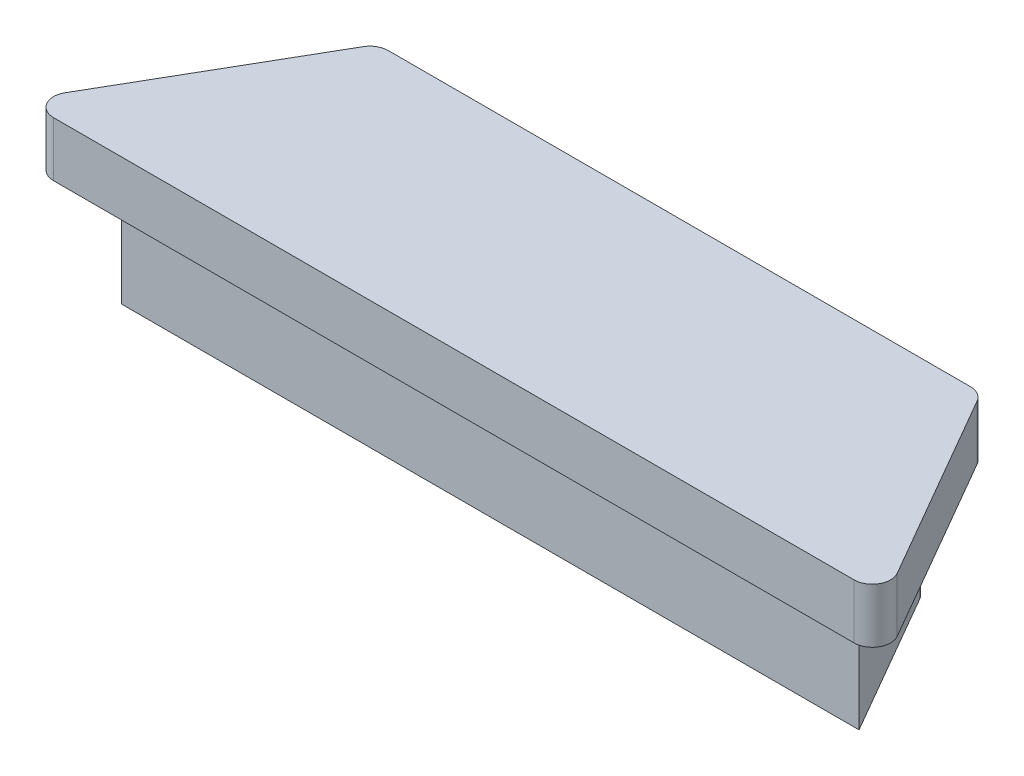
ISO-10303-21;
HEADER;
FILE_DESCRIPTION(('STEP AP214'),'2;1');
FILE_NAME('part.step','',(''),(''),'','','');
FILE_SCHEMA(('AUTOMOTIVE_DESIGN { 1 0 10303 214 1 1 1 1 }'));
ENDSEC;
DATA;
#1=APPLICATION_CONTEXT('core data for automotive mechanical design processes');
#2=APPLICATION_PROTOCOL_DEFINITION('international standard','automotive_design',2000,#1);
#3=PRODUCT_CONTEXT('',#1,'mechanical');
#4=PRODUCT('Part','Part','',(#3));
#5=PRODUCT_RELATED_PRODUCT_CATEGORY('part','',(#4));
#6=PRODUCT_DEFINITION_FORMATION('','',#4);
#7=PRODUCT_DEFINITION_CONTEXT('part definition',#1,'design');
#8=PRODUCT_DEFINITION('design','',#6,#7);
#9=PRODUCT_DEFINITION_SHAPE('','',#8);
#10=(LENGTH_UNIT() NAMED_UNIT(*) SI_UNIT(.MILLI.,.METRE.));
#11=(NAMED_UNIT(*) PLANE_ANGLE_UNIT() SI_UNIT($,.RADIAN.));
#12=(NAMED_UNIT(*) SI_UNIT($,.STERADIAN.) SOLID_ANGLE_UNIT());
#13=UNCERTAINTY_MEASURE_WITH_UNIT(LENGTH_MEASURE(1.E-05),#10,'distance_accuracy_value','');
#14=(GEOMETRIC_REPRESENTATION_CONTEXT(3) GLOBAL_UNCERTAINTY_ASSIGNED_CONTEXT((#13)) GLOBAL_UNIT_ASSIGNED_CONTEXT((#10,
#11,#12)) REPRESENTATION_CONTEXT('',''));
#15=CARTESIAN_POINT('',(0.,0.,0.));
#16=DIRECTION('',(0.,0.,1.));
#17=DIRECTION('',(1.,0.,0.));
#18=AXIS2_PLACEMENT_3D('',#15,#16,#17);
#19=CARTESIAN_POINT('',(-21.0429613812121,6.,-70.8226089891099));
#20=DIRECTION('',(0.,-1.,0.));
#21=DIRECTION('',(0.,0.,-1.));
#22=AXIS2_PLACEMENT_3D('',#19,#20,#21);
#23=CYLINDRICAL_SURFACE('',#22,0.999999999999986);
#24=CARTESIAN_POINT('',(-21.0429613812121,0.,-70.8226089891099));
#25=DIRECTION('',(0.,1.,0.));
#26=DIRECTION('',(0.,0.,-1.));
#27=AXIS2_PLACEMENT_3D('',#24,#25,#26);
#28=CIRCLE('',#27,0.999999999999986);
#29=CARTESIAN_POINT('',(-20.1769359774277,0.,-71.3226089891099));
#30=VERTEX_POINT('',#29);
#31=CARTESIAN_POINT('',(-21.0429613812121,0.,-71.8226089891099));
#32=VERTEX_POINT('',#31);
#33=EDGE_CURVE('E124',#30,#32,#28,.T.);
#34=ORIENTED_EDGE('',*,*,#33,.T.);
#35=DIRECTION('',(0.,-1.,0.));
#36=VECTOR('',#35,1.);
#37=CARTESIAN_POINT('',(-21.0429613812121,6.,-71.8226089891099));
#38=LINE('',#37,#36);
#39=CARTESIAN_POINT('',(-21.0429613812121,6.,-71.8226089891099));
#40=VERTEX_POINT('',#39);
#41=EDGE_CURVE('E11',#40,#32,#38,.T.);
#42=ORIENTED_EDGE('',*,*,#41,.F.);
#43=CARTESIAN_POINT('',(-21.0429613812121,6.,-70.8226089891099));
#44=DIRECTION('',(0.,1.,0.));
#45=DIRECTION('',(0.,0.,-1.));
#46=AXIS2_PLACEMENT_3D('',#43,#44,#45);
#47=CIRCLE('',#46,0.999999999999986);
#48=CARTESIAN_POINT('',(-20.1769359774277,6.,-71.3226089891099));
#49=VERTEX_POINT('',#48);
#50=EDGE_CURVE('E116',#49,#40,#47,.T.);
#51=ORIENTED_EDGE('',*,*,#50,.F.);
#52=DIRECTION('',(0.,-1.,0.));
#53=VECTOR('',#52,1.);
#54=CARTESIAN_POINT('',(-20.1769359774277,6.,-71.3226089891099));
#55=LINE('',#54,#53);
#56=EDGE_CURVE('E123',#49,#30,#55,.T.);
#57=ORIENTED_EDGE('',*,*,#56,.T.);
#58=EDGE_LOOP('',(#34,#42,#51,#57));
#59=FACE_BOUND('',#58,.T.);
#60=ADVANCED_FACE('F32',(#59),#23,.T.);
#61=CARTESIAN_POINT('',(-21.0429613812121,6.,-71.8226089891099));
#62=DIRECTION('',(0.,0.,1.));
#63=DIRECTION('',(1.,0.,0.));
#64=AXIS2_PLACEMENT_3D('',#61,#62,#63);
#65=PLANE('',#64);
#66=DIRECTION('',(-1.,0.,0.));
#67=VECTOR('',#66,1.);
#68=CARTESIAN_POINT('',(-21.0429613812121,0.,-71.8226089891099));
#69=LINE('',#68,#67);
#70=CARTESIAN_POINT('',(-50.7150557620761,0.,-71.8226089891099));
#71=VERTEX_POINT('',#70);
#72=EDGE_CURVE('E127',#32,#71,#69,.T.);
#73=ORIENTED_EDGE('',*,*,#72,.T.);
#74=DIRECTION('',(0.,-1.,0.));
#75=VECTOR('',#74,1.);
#76=CARTESIAN_POINT('',(-50.7150557620761,6.,-71.8226089891099));
#77=LINE('',#76,#75);
#78=CARTESIAN_POINT('',(-50.7150557620761,6.,-71.8226089891099));
#79=VERTEX_POINT('',#78);
#80=EDGE_CURVE('E40',#79,#71,#77,.T.);
#81=ORIENTED_EDGE('',*,*,#80,.F.);
#82=DIRECTION('',(-1.,0.,0.));
#83=VECTOR('',#82,1.);
#84=CARTESIAN_POINT('',(-21.0429613812121,6.,-71.8226089891099));
#85=LINE('',#84,#83);
#86=EDGE_CURVE('E84',#40,#79,#85,.T.);
#87=ORIENTED_EDGE('',*,*,#86,.F.);
#88=ORIENTED_EDGE('',*,*,#41,.T.);
#89=EDGE_LOOP('',(#73,#81,#87,#88));
#90=FACE_BOUND('',#89,.T.);
#91=ADVANCED_FACE('F268',(#90),#65,.F.);
#92=CARTESIAN_POINT('',(-50.7150557620761,6.,-70.8226089891098));
#93=DIRECTION('',(0.,-1.,0.));
#94=DIRECTION('',(0.,0.,-1.));
#95=AXIS2_PLACEMENT_3D('',#92,#93,#94);
#96=CYLINDRICAL_SURFACE('',#95,1.);
#97=CARTESIAN_POINT('',(-50.7150557620761,0.,-70.8226089891098));
#98=DIRECTION('',(0.,1.,0.));
#99=DIRECTION('',(0.,0.,1.));
#100=AXIS2_PLACEMENT_3D('',#97,#98,#99);
#101=CIRCLE('',#100,1.);
#102=CARTESIAN_POINT('',(-51.5810811658605,0.,-71.3226089891098));
#103=VERTEX_POINT('',#102);
#104=EDGE_CURVE('E100',#71,#103,#101,.T.);
#105=ORIENTED_EDGE('',*,*,#104,.T.);
#106=DIRECTION('',(0.,-1.,0.));
#107=VECTOR('',#106,1.);
#108=CARTESIAN_POINT('',(-51.5810811658605,6.,-71.3226089891098));
#109=LINE('',#108,#107);
#110=CARTESIAN_POINT('',(-51.5810811658605,6.,-71.3226089891098));
#111=VERTEX_POINT('',#110);
#112=EDGE_CURVE('E93',#111,#103,#109,.T.);
#113=ORIENTED_EDGE('',*,*,#112,.F.);
#114=CARTESIAN_POINT('',(-50.7150557620761,6.,-70.8226089891098));
#115=DIRECTION('',(0.,1.,0.));
#116=DIRECTION('',(0.,0.,1.));
#117=AXIS2_PLACEMENT_3D('',#114,#115,#116);
#118=CIRCLE('',#117,1.);
#119=EDGE_CURVE('E98',#79,#111,#118,.T.);
#120=ORIENTED_EDGE('',*,*,#119,.F.);
#121=ORIENTED_EDGE('',*,*,#80,.T.);
#122=EDGE_LOOP('',(#105,#113,#120,#121));
#123=FACE_BOUND('',#122,.T.);
#124=ADVANCED_FACE('F95',(#123),#96,.T.);
#125=CARTESIAN_POINT('',(-56.1327372476121,6.,-63.4389093969362));
#126=DIRECTION('',(0.866025403784439,0.,0.499999999999999));
#127=DIRECTION('',(0.499999999999999,0.,-0.866025403784439));
#128=AXIS2_PLACEMENT_3D('',#125,#126,#127);
#129=PLANE('',#128);
#130=DIRECTION('',(-0.499999999999999,0.,0.866025403784439));
#131=VECTOR('',#130,1.);
#132=CARTESIAN_POINT('',(-56.1327372476121,0.,-63.4389093969362));
#133=LINE('',#132,#131);
#134=CARTESIAN_POINT('',(-56.1327372476121,0.,-63.4389093969362));
#135=VERTEX_POINT('',#134);
#136=EDGE_CURVE('E131',#103,#135,#133,.T.);
#137=ORIENTED_EDGE('',*,*,#136,.T.);
#138=DIRECTION('',(0.,-1.,0.));
#139=VECTOR('',#138,1.);
#140=CARTESIAN_POINT('',(-56.1327372476121,6.,-63.4389093969362));
#141=LINE('',#140,#139);
#142=CARTESIAN_POINT('',(-56.1327372476121,6.,-63.4389093969362));
#143=VERTEX_POINT('',#142);
#144=EDGE_CURVE('E103',#143,#135,#141,.T.);
#145=ORIENTED_EDGE('',*,*,#144,.F.);
#146=DIRECTION('',(-0.499999999999999,0.,0.866025403784439));
#147=VECTOR('',#146,1.);
#148=CARTESIAN_POINT('',(-56.1327372476121,6.,-63.4389093969362));
#149=LINE('',#148,#147);
#150=EDGE_CURVE('E106',#111,#143,#149,.T.);
#151=ORIENTED_EDGE('',*,*,#150,.F.);
#152=ORIENTED_EDGE('',*,*,#112,.T.);
#153=EDGE_LOOP('',(#137,#145,#151,#152));
#154=FACE_BOUND('',#153,.T.);
#155=ADVANCED_FACE('F107',(#154),#129,.F.);
#156=CARTESIAN_POINT('',(-15.6252798956755,6.,-63.4389093969362));
#157=DIRECTION('',(0.,0.,-1.));
#158=DIRECTION('',(-1.,0.,0.));
#159=AXIS2_PLACEMENT_3D('',#156,#157,#158);
#160=PLANE('',#159);
#161=DIRECTION('',(1.,0.,0.));
#162=VECTOR('',#161,1.);
#163=CARTESIAN_POINT('',(-15.6252798956755,0.,-63.4389093969362));
#164=LINE('',#163,#162);
#165=CARTESIAN_POINT('',(-15.6252798956755,0.,-63.4389093969362));
#166=VERTEX_POINT('',#165);
#167=EDGE_CURVE('E70',#135,#166,#164,.T.);
#168=ORIENTED_EDGE('',*,*,#167,.T.);
#169=DIRECTION('',(0.,-1.,0.));
#170=VECTOR('',#169,1.);
#171=CARTESIAN_POINT('',(-15.6252798956755,6.,-63.4389093969362));
#172=LINE('',#171,#170);
#173=CARTESIAN_POINT('',(-15.6252798956755,6.,-63.4389093969362));
#174=VERTEX_POINT('',#173);
#175=EDGE_CURVE('E48',#174,#166,#172,.T.);
#176=ORIENTED_EDGE('',*,*,#175,.F.);
#177=DIRECTION('',(1.,0.,0.));
#178=VECTOR('',#177,1.);
#179=CARTESIAN_POINT('',(-15.6252798956755,6.,-63.4389093969362));
#180=LINE('',#179,#178);
#181=EDGE_CURVE('E110',#143,#174,#180,.T.);
#182=ORIENTED_EDGE('',*,*,#181,.F.);
#183=ORIENTED_EDGE('',*,*,#144,.T.);
#184=EDGE_LOOP('',(#168,#176,#182,#183));
#185=FACE_BOUND('',#184,.T.);
#186=ADVANCED_FACE('F140',(#185),#160,.F.);
#187=CARTESIAN_POINT('',(-15.6252798956755,6.,-63.4389093969362));
#188=DIRECTION('',(-0.866025403784412,0.,0.500000000000046));
#189=DIRECTION('',(0.500000000000046,0.,0.866025403784412));
#190=AXIS2_PLACEMENT_3D('',#187,#188,#189);
#191=PLANE('',#190);
#192=DIRECTION('',(-0.500000000000046,0.,-0.866025403784412));
#193=VECTOR('',#192,1.);
#194=CARTESIAN_POINT('',(-15.6252798956755,0.,-63.4389093969362));
#195=LINE('',#194,#193);
#196=EDGE_CURVE('E76',#166,#30,#195,.T.);
#197=ORIENTED_EDGE('',*,*,#196,.T.);
#198=ORIENTED_EDGE('',*,*,#56,.F.);
#199=DIRECTION('',(-0.500000000000046,0.,-0.866025403784412));
#200=VECTOR('',#199,1.);
#201=CARTESIAN_POINT('',(-15.6252798956755,6.,-63.4389093969362));
#202=LINE('',#201,#200);
#203=EDGE_CURVE('E121',#174,#49,#202,.T.);
#204=ORIENTED_EDGE('',*,*,#203,.F.);
#205=ORIENTED_EDGE('',*,*,#175,.T.);
#206=EDGE_LOOP('',(#197,#198,#204,#205));
#207=FACE_BOUND('',#206,.T.);
#208=ADVANCED_FACE('F143',(#207),#191,.F.);
#209=CARTESIAN_POINT('',(-21.0429613812121,0.,-70.8226089891099));
#210=DIRECTION('',(0.,-1.,0.));
#211=DIRECTION('',(0.,0.,-1.));
#212=AXIS2_PLACEMENT_3D('',#209,#210,#211);
#213=PLANE('',#212);
#214=ORIENTED_EDGE('',*,*,#33,.F.);
#215=ORIENTED_EDGE('',*,*,#196,.F.);
#216=ORIENTED_EDGE('',*,*,#167,.F.);
#217=ORIENTED_EDGE('',*,*,#136,.F.);
#218=ORIENTED_EDGE('',*,*,#104,.F.);
#219=ORIENTED_EDGE('',*,*,#72,.F.);
#220=EDGE_LOOP('',(#214,#215,#216,#217,#218,#219));
#221=FACE_BOUND('',#220,.T.);
#222=ADVANCED_FACE('F139',(#221),#213,.T.);
#223=CARTESIAN_POINT('',(-57.864788055181,6.,-62.4389093969362));
#224=DIRECTION('',(0.,1.,0.));
#225=DIRECTION('',(0.,0.,1.));
#226=AXIS2_PLACEMENT_3D('',#223,#224,#225);
#227=PLANE('',#226);
#228=CARTESIAN_POINT('',(-57.864788055181,6.,-62.4389093969362));
#229=DIRECTION('',(0.,1.,0.));
#230=DIRECTION('',(0.,0.,1.));
#231=AXIS2_PLACEMENT_3D('',#228,#229,#230);
#232=CIRCLE('',#231,1.);
#233=CARTESIAN_POINT('',(-58.7308134589655,6.,-62.9389093969362));
#234=VERTEX_POINT('',#233);
#235=CARTESIAN_POINT('',(-57.864788055181,6.,-61.4389093969362));
#236=VERTEX_POINT('',#235);
#237=EDGE_CURVE('E192',#234,#236,#232,.T.);
#238=ORIENTED_EDGE('',*,*,#237,.F.);
#239=DIRECTION('',(-0.5,0.,0.866025403784438));
#240=VECTOR('',#239,1.);
#241=CARTESIAN_POINT('',(-52.7357817042398,6.,-73.3226089891099));
#242=LINE('',#241,#240);
#243=CARTESIAN_POINT('',(-52.7357817042398,6.,-73.3226089891099));
#244=VERTEX_POINT('',#243);
#245=EDGE_CURVE('E170',#244,#234,#242,.T.);
#246=ORIENTED_EDGE('',*,*,#245,.F.);
#247=CARTESIAN_POINT('',(-51.8697563004554,6.,-72.8226089891099));
#248=DIRECTION('',(0.,1.,0.));
#249=DIRECTION('',(0.,0.,1.));
#250=AXIS2_PLACEMENT_3D('',#247,#248,#249);
#251=CIRCLE('',#250,1.);
#252=CARTESIAN_POINT('',(-51.8697563004554,6.,-73.8226089891099));
#253=VERTEX_POINT('',#252);
#254=EDGE_CURVE('E174',#253,#244,#251,.T.);
#255=ORIENTED_EDGE('',*,*,#254,.F.);
#256=DIRECTION('',(-1.,0.,0.));
#257=VECTOR('',#256,1.);
#258=CARTESIAN_POINT('',(-51.8697563004554,6.,-73.8226089891099));
#259=LINE('',#258,#257);
#260=CARTESIAN_POINT('',(-19.8882608428319,6.,-73.8226089891099));
#261=VERTEX_POINT('',#260);
#262=EDGE_CURVE('E177',#261,#253,#259,.T.);
#263=ORIENTED_EDGE('',*,*,#262,.F.);
#264=CARTESIAN_POINT('',(-19.8882608428319,6.,-72.8226089891099));
#265=DIRECTION('',(0.,1.,0.));
#266=DIRECTION('',(0.,0.,1.));
#267=AXIS2_PLACEMENT_3D('',#264,#265,#266);
#268=CIRCLE('',#267,1.);
#269=CARTESIAN_POINT('',(-19.0222354390474,6.,-73.3226089891099));
#270=VERTEX_POINT('',#269);
#271=EDGE_CURVE('E180',#270,#261,#268,.T.);
#272=ORIENTED_EDGE('',*,*,#271,.F.);
#273=DIRECTION('',(-0.5,0.,-0.866025403784439));
#274=VECTOR('',#273,1.);
#275=CARTESIAN_POINT('',(-13.0272036843218,6.,-62.9389093969362));
#276=LINE('',#275,#274);
#277=CARTESIAN_POINT('',(-13.0272036843218,6.,-62.9389093969362));
#278=VERTEX_POINT('',#277);
#279=EDGE_CURVE('E183',#278,#270,#276,.T.);
#280=ORIENTED_EDGE('',*,*,#279,.F.);
#281=CARTESIAN_POINT('',(-13.8932290881062,6.,-62.4389093969362));
#282=DIRECTION('',(0.,1.,0.));
#283=DIRECTION('',(0.,0.,-1.));
#284=AXIS2_PLACEMENT_3D('',#281,#282,#283);
#285=CIRCLE('',#284,1.);
#286=CARTESIAN_POINT('',(-13.8932290881062,6.,-61.4389093969362));
#287=VERTEX_POINT('',#286);
#288=EDGE_CURVE('E186',#287,#278,#285,.T.);
#289=ORIENTED_EDGE('',*,*,#288,.F.);
#290=DIRECTION('',(1.,0.,0.));
#291=VECTOR('',#290,1.);
#292=CARTESIAN_POINT('',(-13.8932290881062,6.,-61.4389093969362));
#293=LINE('',#292,#291);
#294=EDGE_CURVE('E189',#236,#287,#293,.T.);
#295=ORIENTED_EDGE('',*,*,#294,.F.);
#296=EDGE_LOOP('',(#238,#246,#255,#263,#272,#280,#289,#295));
#297=FACE_BOUND('',#296,.T.);
#298=ORIENTED_EDGE('',*,*,#203,.T.);
#299=ORIENTED_EDGE('',*,*,#50,.T.);
#300=ORIENTED_EDGE('',*,*,#86,.T.);
#301=ORIENTED_EDGE('',*,*,#119,.T.);
#302=ORIENTED_EDGE('',*,*,#150,.T.);
#303=ORIENTED_EDGE('',*,*,#181,.T.);
#304=EDGE_LOOP('',(#298,#299,#300,#301,#302,#303));
#305=FACE_BOUND('',#304,.T.);
#306=ADVANCED_FACE('F113',(#297,#305),#227,.F.);
#307=CARTESIAN_POINT('',(-57.864788055181,9.,-62.4389093969362));
#308=DIRECTION('',(0.,-1.,0.));
#309=DIRECTION('',(0.,0.,-1.));
#310=AXIS2_PLACEMENT_3D('',#307,#308,#309);
#311=CYLINDRICAL_SURFACE('',#310,1.);
#312=ORIENTED_EDGE('',*,*,#237,.T.);
#313=DIRECTION('',(0.,-1.,0.));
#314=VECTOR('',#313,1.);
#315=CARTESIAN_POINT('',(-57.864788055181,9.,-61.4389093969362));
#316=LINE('',#315,#314);
#317=CARTESIAN_POINT('',(-57.864788055181,9.,-61.4389093969362));
#318=VERTEX_POINT('',#317);
#319=EDGE_CURVE('E128',#318,#236,#316,.T.);
#320=ORIENTED_EDGE('',*,*,#319,.F.);
#321=CARTESIAN_POINT('',(-57.864788055181,9.,-62.4389093969362));
#322=DIRECTION('',(0.,1.,0.));
#323=DIRECTION('',(0.,0.,1.));
#324=AXIS2_PLACEMENT_3D('',#321,#322,#323);
#325=CIRCLE('',#324,1.);
#326=CARTESIAN_POINT('',(-58.7308134589655,9.,-62.9389093969362));
#327=VERTEX_POINT('',#326);
#328=EDGE_CURVE('E173',#327,#318,#325,.T.);
#329=ORIENTED_EDGE('',*,*,#328,.F.);
#330=DIRECTION('',(0.,-1.,0.));
#331=VECTOR('',#330,1.);
#332=CARTESIAN_POINT('',(-58.7308134589655,9.,-62.9389093969362));
#333=LINE('',#332,#331);
#334=EDGE_CURVE('E166',#327,#234,#333,.T.);
#335=ORIENTED_EDGE('',*,*,#334,.T.);
#336=EDGE_LOOP('',(#312,#320,#329,#335));
#337=FACE_BOUND('',#336,.T.);
#338=ADVANCED_FACE('F229',(#337),#311,.T.);
#339=CARTESIAN_POINT('',(-13.8932290881062,9.,-61.4389093969362));
#340=DIRECTION('',(0.,0.,-1.));
#341=DIRECTION('',(-1.,0.,0.));
#342=AXIS2_PLACEMENT_3D('',#339,#340,#341);
#343=PLANE('',#342);
#344=ORIENTED_EDGE('',*,*,#294,.T.);
#345=DIRECTION('',(0.,-1.,0.));
#346=VECTOR('',#345,1.);
#347=CARTESIAN_POINT('',(-13.8932290881062,9.,-61.4389093969362));
#348=LINE('',#347,#346);
#349=CARTESIAN_POINT('',(-13.8932290881062,9.,-61.4389093969362));
#350=VERTEX_POINT('',#349);
#351=EDGE_CURVE('E148',#350,#287,#348,.T.);
#352=ORIENTED_EDGE('',*,*,#351,.F.);
#353=DIRECTION('',(1.,0.,0.));
#354=VECTOR('',#353,1.);
#355=CARTESIAN_POINT('',(-13.8932290881062,9.,-61.4389093969362));
#356=LINE('',#355,#354);
#357=EDGE_CURVE('E212',#318,#350,#356,.T.);
#358=ORIENTED_EDGE('',*,*,#357,.F.);
#359=ORIENTED_EDGE('',*,*,#319,.T.);
#360=EDGE_LOOP('',(#344,#352,#358,#359));
#361=FACE_BOUND('',#360,.T.);
#362=ADVANCED_FACE('F233',(#361),#343,.F.);
#363=CARTESIAN_POINT('',(-13.8932290881062,9.,-62.4389093969362));
#364=DIRECTION('',(0.,-1.,0.));
#365=DIRECTION('',(0.,0.,-1.));
#366=AXIS2_PLACEMENT_3D('',#363,#364,#365);
#367=CYLINDRICAL_SURFACE('',#366,1.);
#368=ORIENTED_EDGE('',*,*,#288,.T.);
#369=DIRECTION('',(0.,-1.,0.));
#370=VECTOR('',#369,1.);
#371=CARTESIAN_POINT('',(-13.0272036843218,9.,-62.9389093969362));
#372=LINE('',#371,#370);
#373=CARTESIAN_POINT('',(-13.0272036843218,9.,-62.9389093969362));
#374=VERTEX_POINT('',#373);
#375=EDGE_CURVE('E151',#374,#278,#372,.T.);
#376=ORIENTED_EDGE('',*,*,#375,.F.);
#377=CARTESIAN_POINT('',(-13.8932290881062,9.,-62.4389093969362));
#378=DIRECTION('',(0.,1.,0.));
#379=DIRECTION('',(0.,0.,-1.));
#380=AXIS2_PLACEMENT_3D('',#377,#378,#379);
#381=CIRCLE('',#380,1.);
#382=EDGE_CURVE('E209',#350,#374,#381,.T.);
#383=ORIENTED_EDGE('',*,*,#382,.F.);
#384=ORIENTED_EDGE('',*,*,#351,.T.);
#385=EDGE_LOOP('',(#368,#376,#383,#384));
#386=FACE_BOUND('',#385,.T.);
#387=ADVANCED_FACE('F285',(#386),#367,.T.);
#388=CARTESIAN_POINT('',(-13.0272036843218,9.,-62.9389093969362));
#389=DIRECTION('',(-0.866025403784439,0.,0.5));
#390=DIRECTION('',(0.5,0.,0.866025403784439));
#391=AXIS2_PLACEMENT_3D('',#388,#389,#390);
#392=PLANE('',#391);
#393=ORIENTED_EDGE('',*,*,#279,.T.);
#394=DIRECTION('',(0.,-1.,0.));
#395=VECTOR('',#394,1.);
#396=CARTESIAN_POINT('',(-19.0222354390474,9.,-73.3226089891099));
#397=LINE('',#396,#395);
#398=CARTESIAN_POINT('',(-19.0222354390474,9.,-73.3226089891099));
#399=VERTEX_POINT('',#398);
#400=EDGE_CURVE('E154',#399,#270,#397,.T.);
#401=ORIENTED_EDGE('',*,*,#400,.F.);
#402=DIRECTION('',(-0.5,0.,-0.866025403784439));
#403=VECTOR('',#402,1.);
#404=CARTESIAN_POINT('',(-13.0272036843218,9.,-62.9389093969362));
#405=LINE('',#404,#403);
#406=EDGE_CURVE('E206',#374,#399,#405,.T.);
#407=ORIENTED_EDGE('',*,*,#406,.F.);
#408=ORIENTED_EDGE('',*,*,#375,.T.);
#409=EDGE_LOOP('',(#393,#401,#407,#408));
#410=FACE_BOUND('',#409,.T.);
#411=ADVANCED_FACE('F288',(#410),#392,.F.);
#412=CARTESIAN_POINT('',(-19.8882608428319,9.,-72.8226089891099));
#413=DIRECTION('',(0.,-1.,0.));
#414=DIRECTION('',(0.,0.,-1.));
#415=AXIS2_PLACEMENT_3D('',#412,#413,#414);
#416=CYLINDRICAL_SURFACE('',#415,1.);
#417=ORIENTED_EDGE('',*,*,#271,.T.);
#418=DIRECTION('',(0.,-1.,0.));
#419=VECTOR('',#418,1.);
#420=CARTESIAN_POINT('',(-19.8882608428319,9.,-73.8226089891099));
#421=LINE('',#420,#419);
#422=CARTESIAN_POINT('',(-19.8882608428319,9.,-73.8226089891099));
#423=VERTEX_POINT('',#422);
#424=EDGE_CURVE('E157',#423,#261,#421,.T.);
#425=ORIENTED_EDGE('',*,*,#424,.F.);
#426=CARTESIAN_POINT('',(-19.8882608428319,9.,-72.8226089891099));
#427=DIRECTION('',(0.,1.,0.));
#428=DIRECTION('',(0.,0.,1.));
#429=AXIS2_PLACEMENT_3D('',#426,#427,#428);
#430=CIRCLE('',#429,1.);
#431=EDGE_CURVE('E203',#399,#423,#430,.T.);
#432=ORIENTED_EDGE('',*,*,#431,.F.);
#433=ORIENTED_EDGE('',*,*,#400,.T.);
#434=EDGE_LOOP('',(#417,#425,#432,#433));
#435=FACE_BOUND('',#434,.T.);
#436=ADVANCED_FACE('F292',(#435),#416,.T.);
#437=CARTESIAN_POINT('',(-51.8697563004554,9.,-73.8226089891099));
#438=DIRECTION('',(0.,0.,1.));
#439=DIRECTION('',(1.,0.,0.));
#440=AXIS2_PLACEMENT_3D('',#437,#438,#439);
#441=PLANE('',#440);
#442=ORIENTED_EDGE('',*,*,#262,.T.);
#443=DIRECTION('',(0.,-1.,0.));
#444=VECTOR('',#443,1.);
#445=CARTESIAN_POINT('',(-51.8697563004554,9.,-73.8226089891099));
#446=LINE('',#445,#444);
#447=CARTESIAN_POINT('',(-51.8697563004554,9.,-73.8226089891099));
#448=VERTEX_POINT('',#447);
#449=EDGE_CURVE('E160',#448,#253,#446,.T.);
#450=ORIENTED_EDGE('',*,*,#449,.F.);
#451=DIRECTION('',(-1.,0.,0.));
#452=VECTOR('',#451,1.);
#453=CARTESIAN_POINT('',(-51.8697563004554,9.,-73.8226089891099));
#454=LINE('',#453,#452);
#455=EDGE_CURVE('E200',#423,#448,#454,.T.);
#456=ORIENTED_EDGE('',*,*,#455,.F.);
#457=ORIENTED_EDGE('',*,*,#424,.T.);
#458=EDGE_LOOP('',(#442,#450,#456,#457));
#459=FACE_BOUND('',#458,.T.);
#460=ADVANCED_FACE('F296',(#459),#441,.F.);
#461=CARTESIAN_POINT('',(-51.8697563004554,9.,-72.8226089891099));
#462=DIRECTION('',(0.,-1.,0.));
#463=DIRECTION('',(0.,0.,-1.));
#464=AXIS2_PLACEMENT_3D('',#461,#462,#463);
#465=CYLINDRICAL_SURFACE('',#464,1.);
#466=ORIENTED_EDGE('',*,*,#254,.T.);
#467=DIRECTION('',(0.,-1.,0.));
#468=VECTOR('',#467,1.);
#469=CARTESIAN_POINT('',(-52.7357817042398,9.,-73.3226089891099));
#470=LINE('',#469,#468);
#471=CARTESIAN_POINT('',(-52.7357817042398,9.,-73.3226089891099));
#472=VERTEX_POINT('',#471);
#473=EDGE_CURVE('E163',#472,#244,#470,.T.);
#474=ORIENTED_EDGE('',*,*,#473,.F.);
#475=CARTESIAN_POINT('',(-51.8697563004554,9.,-72.8226089891099));
#476=DIRECTION('',(0.,1.,0.));
#477=DIRECTION('',(0.,0.,1.));
#478=AXIS2_PLACEMENT_3D('',#475,#476,#477);
#479=CIRCLE('',#478,1.);
#480=EDGE_CURVE('E197',#448,#472,#479,.T.);
#481=ORIENTED_EDGE('',*,*,#480,.F.);
#482=ORIENTED_EDGE('',*,*,#449,.T.);
#483=EDGE_LOOP('',(#466,#474,#481,#482));
#484=FACE_BOUND('',#483,.T.);
#485=ADVANCED_FACE('F300',(#484),#465,.T.);
#486=CARTESIAN_POINT('',(-52.7357817042398,9.,-73.3226089891099));
#487=DIRECTION('',(0.866025403784439,0.,0.5));
#488=DIRECTION('',(0.5,0.,-0.866025403784439));
#489=AXIS2_PLACEMENT_3D('',#486,#487,#488);
#490=PLANE('',#489);
#491=ORIENTED_EDGE('',*,*,#245,.T.);
#492=ORIENTED_EDGE('',*,*,#334,.F.);
#493=DIRECTION('',(-0.5,0.,0.866025403784438));
#494=VECTOR('',#493,1.);
#495=CARTESIAN_POINT('',(-52.7357817042398,9.,-73.3226089891099));
#496=LINE('',#495,#494);
#497=EDGE_CURVE('E169',#472,#327,#496,.T.);
#498=ORIENTED_EDGE('',*,*,#497,.F.);
#499=ORIENTED_EDGE('',*,*,#473,.T.);
#500=EDGE_LOOP('',(#491,#492,#498,#499));
#501=FACE_BOUND('',#500,.T.);
#502=ADVANCED_FACE('F254',(#501),#490,.F.);
#503=CARTESIAN_POINT('',(-57.864788055181,9.,-62.4389093969362));
#504=DIRECTION('',(0.,1.,0.));
#505=DIRECTION('',(0.,0.,1.));
#506=AXIS2_PLACEMENT_3D('',#503,#504,#505);
#507=PLANE('',#506);
#508=ORIENTED_EDGE('',*,*,#328,.T.);
#509=ORIENTED_EDGE('',*,*,#357,.T.);
#510=ORIENTED_EDGE('',*,*,#382,.T.);
#511=ORIENTED_EDGE('',*,*,#406,.T.);
#512=ORIENTED_EDGE('',*,*,#431,.T.);
#513=ORIENTED_EDGE('',*,*,#455,.T.);
#514=ORIENTED_EDGE('',*,*,#480,.T.);
#515=ORIENTED_EDGE('',*,*,#497,.T.);
#516=EDGE_LOOP('',(#508,#509,#510,#511,#512,#513,#514,#515));
#517=FACE_BOUND('',#516,.T.);
#518=ADVANCED_FACE('F220',(#517),#507,.T.);
#519=CLOSED_SHELL('',(#60,#91,#124,#155,#186,#208,#222,#306,#338,#362,#387,#411,#436,#460,#485,
#502,#518));
#520=MANIFOLD_SOLID_BREP('B2',#519);
#521=ADVANCED_BREP_SHAPE_REPRESENTATION('',(#18,#520),#14);
#522=SHAPE_DEFINITION_REPRESENTATION(#9,#521);
ENDSEC;
END-ISO-10303-21;
